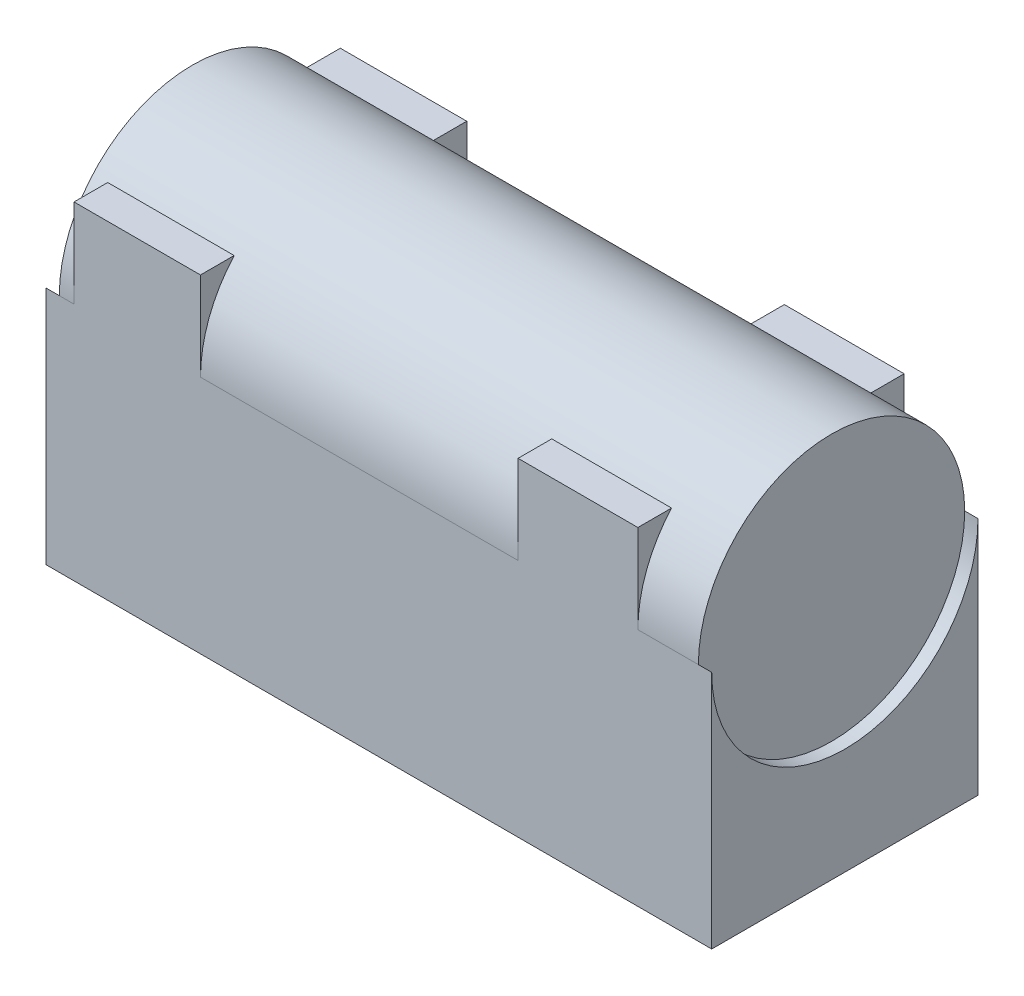
ISO-10303-21;
HEADER;
FILE_DESCRIPTION(('STEP AP214'),'2;1');
FILE_NAME('part.step','',(''),(''),'','','');
FILE_SCHEMA(('AUTOMOTIVE_DESIGN { 1 0 10303 214 1 1 1 1 }'));
ENDSEC;
DATA;
#1=APPLICATION_CONTEXT('core data for automotive mechanical design processes');
#2=APPLICATION_PROTOCOL_DEFINITION('international standard','automotive_design',2000,#1);
#3=PRODUCT_CONTEXT('',#1,'mechanical');
#4=PRODUCT('Part','Part','',(#3));
#5=PRODUCT_RELATED_PRODUCT_CATEGORY('part','',(#4));
#6=PRODUCT_DEFINITION_FORMATION('','',#4);
#7=PRODUCT_DEFINITION_CONTEXT('part definition',#1,'design');
#8=PRODUCT_DEFINITION('design','',#6,#7);
#9=PRODUCT_DEFINITION_SHAPE('','',#8);
#10=(LENGTH_UNIT() NAMED_UNIT(*) SI_UNIT(.MILLI.,.METRE.));
#11=(NAMED_UNIT(*) PLANE_ANGLE_UNIT() SI_UNIT($,.RADIAN.));
#12=(NAMED_UNIT(*) SI_UNIT($,.STERADIAN.) SOLID_ANGLE_UNIT());
#13=UNCERTAINTY_MEASURE_WITH_UNIT(LENGTH_MEASURE(1.E-05),#10,'distance_accuracy_value','');
#14=(GEOMETRIC_REPRESENTATION_CONTEXT(3) GLOBAL_UNCERTAINTY_ASSIGNED_CONTEXT((#13)) GLOBAL_UNIT_ASSIGNED_CONTEXT((#10,
#11,#12)) REPRESENTATION_CONTEXT('',''));
#15=CARTESIAN_POINT('',(0.,0.,0.));
#16=DIRECTION('',(0.,0.,1.));
#17=DIRECTION('',(1.,0.,0.));
#18=AXIS2_PLACEMENT_3D('',#15,#16,#17);
#19=CARTESIAN_POINT('',(12.5,9.,0.));
#20=DIRECTION('',(-1.,0.,0.));
#21=DIRECTION('',(0.,0.,1.));
#22=AXIS2_PLACEMENT_3D('',#19,#20,#21);
#23=CYLINDRICAL_SURFACE('',#22,5.);
#24=DIRECTION('',(-1.,0.,0.));
#25=VECTOR('',#24,1.);
#26=CARTESIAN_POINT('',(12.5,9.,5.));
#27=LINE('',#26,#25);
#28=CARTESIAN_POINT('',(-12.,9.,5.));
#29=VERTEX_POINT('',#28);
#30=CARTESIAN_POINT('',(-12.5,9.,5.));
#31=VERTEX_POINT('',#30);
#32=EDGE_CURVE('E252',#29,#31,#27,.T.);
#33=ORIENTED_EDGE('',*,*,#32,.F.);
#34=CARTESIAN_POINT('',(-12.,9.,0.));
#35=DIRECTION('',(1.,0.,0.));
#36=DIRECTION('',(0.,0.,-1.));
#37=AXIS2_PLACEMENT_3D('',#34,#35,#36);
#38=CIRCLE('',#37,5.);
#39=CARTESIAN_POINT('',(-12.,9.,-5.));
#40=VERTEX_POINT('',#39);
#41=EDGE_CURVE('E207',#29,#40,#38,.T.);
#42=ORIENTED_EDGE('',*,*,#41,.T.);
#43=DIRECTION('',(-1.,0.,0.));
#44=VECTOR('',#43,1.);
#45=CARTESIAN_POINT('',(12.5,9.,-5.));
#46=LINE('',#45,#44);
#47=CARTESIAN_POINT('',(-12.5,9.,-5.));
#48=VERTEX_POINT('',#47);
#49=EDGE_CURVE('E256',#40,#48,#46,.T.);
#50=ORIENTED_EDGE('',*,*,#49,.T.);
#51=CARTESIAN_POINT('',(-12.5,9.,0.));
#52=DIRECTION('',(1.,0.,0.));
#53=DIRECTION('',(0.,0.,-1.));
#54=AXIS2_PLACEMENT_3D('',#51,#52,#53);
#55=CIRCLE('',#54,5.);
#56=EDGE_CURVE('E240',#31,#48,#55,.T.);
#57=ORIENTED_EDGE('',*,*,#56,.F.);
#58=EDGE_LOOP('',(#33,#42,#50,#57));
#59=FACE_BOUND('',#58,.T.);
#60=ADVANCED_FACE('F33',(#59),#23,.F.);
#61=CARTESIAN_POINT('',(12.5,3.,-5.));
#62=DIRECTION('',(0.,0.,1.));
#63=DIRECTION('',(0.,-1.,0.));
#64=AXIS2_PLACEMENT_3D('',#61,#62,#63);
#65=PLANE('',#64);
#66=DIRECTION('',(0.,1.,0.));
#67=VECTOR('',#66,1.);
#68=CARTESIAN_POINT('',(9.72697882381368,12.3237847243729,-5.));
#69=LINE('',#68,#67);
#70=CARTESIAN_POINT('',(9.72697882381368,9.,-5.));
#71=VERTEX_POINT('',#70);
#72=CARTESIAN_POINT('',(9.72697882381368,12.3237847243729,-5.));
#73=VERTEX_POINT('',#72);
#74=EDGE_CURVE('E58',#71,#73,#69,.T.);
#75=ORIENTED_EDGE('',*,*,#74,.F.);
#76=DIRECTION('',(-1.,0.,0.));
#77=VECTOR('',#76,1.);
#78=CARTESIAN_POINT('',(12.,9.,-5.));
#79=LINE('',#78,#77);
#80=CARTESIAN_POINT('',(12.,9.,-5.));
#81=VERTEX_POINT('',#80);
#82=EDGE_CURVE('E215',#71,#81,#79,.F.);
#83=ORIENTED_EDGE('',*,*,#82,.T.);
#84=CARTESIAN_POINT('',(12.5,9.,-5.));
#85=VERTEX_POINT('',#84);
#86=EDGE_CURVE('E259',#85,#81,#46,.T.);
#87=ORIENTED_EDGE('',*,*,#86,.F.);
#88=DIRECTION('',(0.,1.,0.));
#89=VECTOR('',#88,1.);
#90=CARTESIAN_POINT('',(12.5,0.,-5.));
#91=LINE('',#90,#89);
#92=CARTESIAN_POINT('',(12.5,0.,-5.));
#93=VERTEX_POINT('',#92);
#94=EDGE_CURVE('E225',#93,#85,#91,.T.);
#95=ORIENTED_EDGE('',*,*,#94,.F.);
#96=DIRECTION('',(-1.,0.,0.));
#97=VECTOR('',#96,1.);
#98=CARTESIAN_POINT('',(12.5,0.,-5.));
#99=LINE('',#98,#97);
#100=CARTESIAN_POINT('',(-12.5,0.,-5.));
#101=VERTEX_POINT('',#100);
#102=EDGE_CURVE('E237',#93,#101,#99,.T.);
#103=ORIENTED_EDGE('',*,*,#102,.T.);
#104=DIRECTION('',(0.,1.,0.));
#105=VECTOR('',#104,1.);
#106=CARTESIAN_POINT('',(-12.5,3.,-5.));
#107=LINE('',#106,#105);
#108=EDGE_CURVE('E223',#101,#48,#107,.T.);
#109=ORIENTED_EDGE('',*,*,#108,.T.);
#110=ORIENTED_EDGE('',*,*,#49,.F.);
#111=CARTESIAN_POINT('',(-11.4471496698201,9.,-5.));
#112=VERTEX_POINT('',#111);
#113=EDGE_CURVE('E220',#40,#112,#79,.F.);
#114=ORIENTED_EDGE('',*,*,#113,.T.);
#115=DIRECTION('',(0.,-1.,0.));
#116=VECTOR('',#115,1.);
#117=CARTESIAN_POINT('',(-11.4471496698201,5.6762152756271,-5.));
#118=LINE('',#117,#116);
#119=CARTESIAN_POINT('',(-11.4471496698201,12.3237847243729,-5.));
#120=VERTEX_POINT('',#119);
#121=EDGE_CURVE('E195',#120,#112,#118,.T.);
#122=ORIENTED_EDGE('',*,*,#121,.F.);
#123=DIRECTION('',(-1.,0.,0.));
#124=VECTOR('',#123,1.);
#125=CARTESIAN_POINT('',(-11.4471496698201,12.3237847243729,-5.));
#126=LINE('',#125,#124);
#127=CARTESIAN_POINT('',(-6.69919840795785,12.3237847243729,-5.));
#128=VERTEX_POINT('',#127);
#129=EDGE_CURVE('E191',#128,#120,#126,.T.);
#130=ORIENTED_EDGE('',*,*,#129,.F.);
#131=DIRECTION('',(0.,1.,0.));
#132=VECTOR('',#131,1.);
#133=CARTESIAN_POINT('',(-6.69919840795785,5.6762152756271,-5.));
#134=LINE('',#133,#132);
#135=CARTESIAN_POINT('',(-6.69919840795785,9.,-5.));
#136=VERTEX_POINT('',#135);
#137=EDGE_CURVE('E189',#136,#128,#134,.T.);
#138=ORIENTED_EDGE('',*,*,#137,.F.);
#139=CARTESIAN_POINT('',(5.22784904646301,9.,-5.));
#140=VERTEX_POINT('',#139);
#141=EDGE_CURVE('E224',#136,#140,#79,.F.);
#142=ORIENTED_EDGE('',*,*,#141,.T.);
#143=DIRECTION('',(0.,-1.,0.));
#144=VECTOR('',#143,1.);
#145=CARTESIAN_POINT('',(5.22784904646301,12.3237847243729,-5.));
#146=LINE('',#145,#144);
#147=CARTESIAN_POINT('',(5.22784904646301,12.3237847243729,-5.));
#148=VERTEX_POINT('',#147);
#149=EDGE_CURVE('E176',#148,#140,#146,.T.);
#150=ORIENTED_EDGE('',*,*,#149,.F.);
#151=DIRECTION('',(-1.,0.,0.));
#152=VECTOR('',#151,1.);
#153=CARTESIAN_POINT('',(5.22784904646301,12.3237847243729,-5.));
#154=LINE('',#153,#152);
#155=EDGE_CURVE('E164',#73,#148,#154,.T.);
#156=ORIENTED_EDGE('',*,*,#155,.F.);
#157=EDGE_LOOP('',(#75,#83,#87,#95,#103,#109,#110,#114,#122,#130,#138,#142,#150,#156));
#158=FACE_BOUND('',#157,.T.);
#159=ADVANCED_FACE('F35',(#158),#65,.F.);
#160=CARTESIAN_POINT('',(12.,9.,0.));
#161=DIRECTION('',(1.,0.,0.));
#162=DIRECTION('',(0.,0.,-1.));
#163=AXIS2_PLACEMENT_3D('',#160,#161,#162);
#164=CIRCLE('',#163,5.);
#165=CARTESIAN_POINT('',(12.,9.,5.));
#166=VERTEX_POINT('',#165);
#167=EDGE_CURVE('E216',#166,#81,#164,.T.);
#168=ORIENTED_EDGE('',*,*,#167,.F.);
#169=CARTESIAN_POINT('',(12.5,9.,5.));
#170=VERTEX_POINT('',#169);
#171=EDGE_CURVE('E253',#170,#166,#27,.T.);
#172=ORIENTED_EDGE('',*,*,#171,.F.);
#173=CARTESIAN_POINT('',(12.5,9.,0.));
#174=DIRECTION('',(1.,0.,0.));
#175=DIRECTION('',(0.,0.,-1.));
#176=AXIS2_PLACEMENT_3D('',#173,#174,#175);
#177=CIRCLE('',#176,5.);
#178=EDGE_CURVE('E227',#170,#85,#177,.T.);
#179=ORIENTED_EDGE('',*,*,#178,.T.);
#180=ORIENTED_EDGE('',*,*,#86,.T.);
#181=EDGE_LOOP('',(#168,#172,#179,#180));
#182=FACE_BOUND('',#181,.T.);
#183=ADVANCED_FACE('F299',(#182),#23,.F.);
#184=CARTESIAN_POINT('',(12.5,0.,5.));
#185=DIRECTION('',(0.,0.,1.));
#186=DIRECTION('',(1.,0.,0.));
#187=AXIS2_PLACEMENT_3D('',#184,#185,#186);
#188=PLANE('',#187);
#189=CARTESIAN_POINT('',(9.72697882381368,9.,5.));
#190=VERTEX_POINT('',#189);
#191=EDGE_CURVE('E257',#166,#190,#27,.T.);
#192=ORIENTED_EDGE('',*,*,#191,.T.);
#193=DIRECTION('',(0.,1.,0.));
#194=VECTOR('',#193,1.);
#195=CARTESIAN_POINT('',(9.72697882381368,12.3237847243729,5.));
#196=LINE('',#195,#194);
#197=CARTESIAN_POINT('',(9.72697882381368,12.3237847243729,5.));
#198=VERTEX_POINT('',#197);
#199=EDGE_CURVE('E180',#190,#198,#196,.T.);
#200=ORIENTED_EDGE('',*,*,#199,.T.);
#201=DIRECTION('',(-1.,0.,0.));
#202=VECTOR('',#201,1.);
#203=CARTESIAN_POINT('',(5.22784904646301,12.3237847243729,5.));
#204=LINE('',#203,#202);
#205=CARTESIAN_POINT('',(5.22784904646301,12.3237847243729,5.));
#206=VERTEX_POINT('',#205);
#207=EDGE_CURVE('E183',#198,#206,#204,.T.);
#208=ORIENTED_EDGE('',*,*,#207,.T.);
#209=DIRECTION('',(0.,-1.,0.));
#210=VECTOR('',#209,1.);
#211=CARTESIAN_POINT('',(5.22784904646301,12.3237847243729,5.));
#212=LINE('',#211,#210);
#213=CARTESIAN_POINT('',(5.22784904646301,9.,5.));
#214=VERTEX_POINT('',#213);
#215=EDGE_CURVE('E50',#206,#214,#212,.T.);
#216=ORIENTED_EDGE('',*,*,#215,.T.);
#217=CARTESIAN_POINT('',(-6.69919840795785,9.,5.));
#218=VERTEX_POINT('',#217);
#219=EDGE_CURVE('E258',#214,#218,#27,.T.);
#220=ORIENTED_EDGE('',*,*,#219,.T.);
#221=DIRECTION('',(0.,1.,0.));
#222=VECTOR('',#221,1.);
#223=CARTESIAN_POINT('',(-6.69919840795785,5.6762152756271,5.));
#224=LINE('',#223,#222);
#225=CARTESIAN_POINT('',(-6.69919840795785,12.3237847243729,5.));
#226=VERTEX_POINT('',#225);
#227=EDGE_CURVE('E187',#218,#226,#224,.T.);
#228=ORIENTED_EDGE('',*,*,#227,.T.);
#229=DIRECTION('',(-1.,0.,0.));
#230=VECTOR('',#229,1.);
#231=CARTESIAN_POINT('',(-11.4471496698201,12.3237847243729,5.));
#232=LINE('',#231,#230);
#233=CARTESIAN_POINT('',(-11.4471496698201,12.3237847243729,5.));
#234=VERTEX_POINT('',#233);
#235=EDGE_CURVE('E200',#226,#234,#232,.T.);
#236=ORIENTED_EDGE('',*,*,#235,.T.);
#237=DIRECTION('',(0.,-1.,0.));
#238=VECTOR('',#237,1.);
#239=CARTESIAN_POINT('',(-11.4471496698201,5.6762152756271,5.));
#240=LINE('',#239,#238);
#241=CARTESIAN_POINT('',(-11.4471496698201,9.,5.));
#242=VERTEX_POINT('',#241);
#243=EDGE_CURVE('E192',#234,#242,#240,.T.);
#244=ORIENTED_EDGE('',*,*,#243,.T.);
#245=EDGE_CURVE('E322',#242,#29,#27,.T.);
#246=ORIENTED_EDGE('',*,*,#245,.T.);
#247=ORIENTED_EDGE('',*,*,#32,.T.);
#248=DIRECTION('',(0.,1.,0.));
#249=VECTOR('',#248,1.);
#250=CARTESIAN_POINT('',(-12.5,0.,5.));
#251=LINE('',#250,#249);
#252=CARTESIAN_POINT('',(-12.5,0.,5.));
#253=VERTEX_POINT('',#252);
#254=EDGE_CURVE('E243',#253,#31,#251,.T.);
#255=ORIENTED_EDGE('',*,*,#254,.F.);
#256=DIRECTION('',(-1.,0.,0.));
#257=VECTOR('',#256,1.);
#258=CARTESIAN_POINT('',(12.5,0.,5.));
#259=LINE('',#258,#257);
#260=CARTESIAN_POINT('',(12.5,0.,5.));
#261=VERTEX_POINT('',#260);
#262=EDGE_CURVE('E250',#261,#253,#259,.T.);
#263=ORIENTED_EDGE('',*,*,#262,.F.);
#264=DIRECTION('',(0.,1.,0.));
#265=VECTOR('',#264,1.);
#266=CARTESIAN_POINT('',(12.5,3.,5.));
#267=LINE('',#266,#265);
#268=EDGE_CURVE('E231',#261,#170,#267,.T.);
#269=ORIENTED_EDGE('',*,*,#268,.T.);
#270=ORIENTED_EDGE('',*,*,#171,.T.);
#271=EDGE_LOOP('',(#192,#200,#208,#216,#220,#228,#236,#244,#246,#247,#255,#263,#269,#270));
#272=FACE_BOUND('',#271,.T.);
#273=ADVANCED_FACE('F305',(#272),#188,.T.);
#274=CARTESIAN_POINT('',(12.5,0.,-5.));
#275=DIRECTION('',(0.,-1.,0.));
#276=DIRECTION('',(0.,0.,-1.));
#277=AXIS2_PLACEMENT_3D('',#274,#275,#276);
#278=PLANE('',#277);
#279=DIRECTION('',(0.,0.,1.));
#280=VECTOR('',#279,1.);
#281=CARTESIAN_POINT('',(-12.5,0.,-5.));
#282=LINE('',#281,#280);
#283=EDGE_CURVE('E228',#101,#253,#282,.T.);
#284=ORIENTED_EDGE('',*,*,#283,.F.);
#285=ORIENTED_EDGE('',*,*,#102,.F.);
#286=DIRECTION('',(0.,0.,1.));
#287=VECTOR('',#286,1.);
#288=CARTESIAN_POINT('',(12.5,0.,-5.));
#289=LINE('',#288,#287);
#290=EDGE_CURVE('E234',#93,#261,#289,.T.);
#291=ORIENTED_EDGE('',*,*,#290,.T.);
#292=ORIENTED_EDGE('',*,*,#262,.T.);
#293=EDGE_LOOP('',(#284,#285,#291,#292));
#294=FACE_BOUND('',#293,.T.);
#295=ADVANCED_FACE('F309',(#294),#278,.T.);
#296=CARTESIAN_POINT('',(12.5,9.,0.));
#297=DIRECTION('',(1.,0.,0.));
#298=DIRECTION('',(0.,0.,-1.));
#299=AXIS2_PLACEMENT_3D('',#296,#297,#298);
#300=PLANE('',#299);
#301=ORIENTED_EDGE('',*,*,#94,.T.);
#302=ORIENTED_EDGE('',*,*,#178,.F.);
#303=ORIENTED_EDGE('',*,*,#268,.F.);
#304=ORIENTED_EDGE('',*,*,#290,.F.);
#305=EDGE_LOOP('',(#301,#302,#303,#304));
#306=FACE_BOUND('',#305,.T.);
#307=ADVANCED_FACE('F302',(#306),#300,.T.);
#308=CARTESIAN_POINT('',(-12.5,9.,0.));
#309=DIRECTION('',(1.,0.,0.));
#310=DIRECTION('',(0.,0.,-1.));
#311=AXIS2_PLACEMENT_3D('',#308,#309,#310);
#312=PLANE('',#311);
#313=ORIENTED_EDGE('',*,*,#108,.F.);
#314=ORIENTED_EDGE('',*,*,#283,.T.);
#315=ORIENTED_EDGE('',*,*,#254,.T.);
#316=ORIENTED_EDGE('',*,*,#56,.T.);
#317=EDGE_LOOP('',(#313,#314,#315,#316));
#318=FACE_BOUND('',#317,.T.);
#319=ADVANCED_FACE('F313',(#318),#312,.F.);
#320=CARTESIAN_POINT('',(12.,9.,0.));
#321=DIRECTION('',(-1.,0.,0.));
#322=DIRECTION('',(0.,0.,1.));
#323=AXIS2_PLACEMENT_3D('',#320,#321,#322);
#324=CYLINDRICAL_SURFACE('',#323,5.);
#325=ORIENTED_EDGE('',*,*,#82,.F.);
#326=CARTESIAN_POINT('',(9.72697882381368,9.,0.));
#327=DIRECTION('',(1.,0.,0.));
#328=DIRECTION('',(0.,0.,-1.));
#329=AXIS2_PLACEMENT_3D('',#326,#327,#328);
#330=CIRCLE('',#329,5.);
#331=CARTESIAN_POINT('',(9.72697882381368,12.3237847243729,-3.73529852970621));
#332=VERTEX_POINT('',#331);
#333=EDGE_CURVE('E11',#71,#332,#330,.T.);
#334=ORIENTED_EDGE('',*,*,#333,.T.);
#335=DIRECTION('',(-1.,0.,0.));
#336=VECTOR('',#335,1.);
#337=CARTESIAN_POINT('',(12.,12.3237847243729,-3.73529852970621));
#338=LINE('',#337,#336);
#339=CARTESIAN_POINT('',(5.22784904646301,12.3237847243729,-3.73529852970621));
#340=VERTEX_POINT('',#339);
#341=EDGE_CURVE('E37',#332,#340,#338,.T.);
#342=ORIENTED_EDGE('',*,*,#341,.T.);
#343=CARTESIAN_POINT('',(5.22784904646301,9.,0.));
#344=DIRECTION('',(-1.,0.,0.));
#345=DIRECTION('',(0.,0.,1.));
#346=AXIS2_PLACEMENT_3D('',#343,#344,#345);
#347=CIRCLE('',#346,5.);
#348=EDGE_CURVE('E42',#340,#140,#347,.T.);
#349=ORIENTED_EDGE('',*,*,#348,.T.);
#350=ORIENTED_EDGE('',*,*,#141,.F.);
#351=CARTESIAN_POINT('',(-6.69919840795785,9.,0.));
#352=DIRECTION('',(1.,0.,0.));
#353=DIRECTION('',(0.,0.,-1.));
#354=AXIS2_PLACEMENT_3D('',#351,#352,#353);
#355=CIRCLE('',#354,5.);
#356=CARTESIAN_POINT('',(-6.69919840795785,12.3237847243729,-3.73529852970621));
#357=VERTEX_POINT('',#356);
#358=EDGE_CURVE('E273',#136,#357,#355,.T.);
#359=ORIENTED_EDGE('',*,*,#358,.T.);
#360=DIRECTION('',(-1.,0.,0.));
#361=VECTOR('',#360,1.);
#362=CARTESIAN_POINT('',(12.,12.3237847243729,-3.73529852970621));
#363=LINE('',#362,#361);
#364=CARTESIAN_POINT('',(-11.4471496698201,12.3237847243729,-3.73529852970621));
#365=VERTEX_POINT('',#364);
#366=EDGE_CURVE('E272',#357,#365,#363,.T.);
#367=ORIENTED_EDGE('',*,*,#366,.T.);
#368=CARTESIAN_POINT('',(-11.4471496698201,9.,0.));
#369=DIRECTION('',(-1.,0.,0.));
#370=DIRECTION('',(0.,0.,1.));
#371=AXIS2_PLACEMENT_3D('',#368,#369,#370);
#372=CIRCLE('',#371,5.);
#373=EDGE_CURVE('E269',#365,#112,#372,.T.);
#374=ORIENTED_EDGE('',*,*,#373,.T.);
#375=ORIENTED_EDGE('',*,*,#113,.F.);
#376=EDGE_CURVE('E217',#40,#29,#38,.T.);
#377=ORIENTED_EDGE('',*,*,#376,.T.);
#378=ORIENTED_EDGE('',*,*,#245,.F.);
#379=CARTESIAN_POINT('',(-11.4471496698201,12.3237847243729,3.73529852970621));
#380=VERTEX_POINT('',#379);
#381=EDGE_CURVE('E265',#242,#380,#372,.T.);
#382=ORIENTED_EDGE('',*,*,#381,.T.);
#383=DIRECTION('',(-1.,0.,0.));
#384=VECTOR('',#383,1.);
#385=CARTESIAN_POINT('',(12.,12.3237847243729,3.73529852970621));
#386=LINE('',#385,#384);
#387=CARTESIAN_POINT('',(-6.69919840795785,12.3237847243729,3.73529852970621));
#388=VERTEX_POINT('',#387);
#389=EDGE_CURVE('E262',#380,#388,#386,.F.);
#390=ORIENTED_EDGE('',*,*,#389,.T.);
#391=EDGE_CURVE('E268',#388,#218,#355,.T.);
#392=ORIENTED_EDGE('',*,*,#391,.T.);
#393=ORIENTED_EDGE('',*,*,#219,.F.);
#394=CARTESIAN_POINT('',(5.22784904646301,12.3237847243729,3.73529852970621));
#395=VERTEX_POINT('',#394);
#396=EDGE_CURVE('E279',#214,#395,#347,.T.);
#397=ORIENTED_EDGE('',*,*,#396,.T.);
#398=DIRECTION('',(-1.,0.,0.));
#399=VECTOR('',#398,1.);
#400=CARTESIAN_POINT('',(12.,12.3237847243729,3.73529852970621));
#401=LINE('',#400,#399);
#402=CARTESIAN_POINT('',(9.72697882381368,12.3237847243729,3.73529852970621));
#403=VERTEX_POINT('',#402);
#404=EDGE_CURVE('E276',#395,#403,#401,.F.);
#405=ORIENTED_EDGE('',*,*,#404,.T.);
#406=EDGE_CURVE('E43',#403,#190,#330,.T.);
#407=ORIENTED_EDGE('',*,*,#406,.T.);
#408=ORIENTED_EDGE('',*,*,#191,.F.);
#409=EDGE_CURVE('E212',#81,#166,#164,.T.);
#410=ORIENTED_EDGE('',*,*,#409,.F.);
#411=EDGE_LOOP('',(#325,#334,#342,#349,#350,#359,#367,#374,#375,#377,#378,#382,#390,#392,#393,
#397,#405,#407,#408,#410));
#412=FACE_BOUND('',#411,.T.);
#413=ADVANCED_FACE('F286',(#412),#324,.T.);
#414=CARTESIAN_POINT('',(12.,0.,0.));
#415=DIRECTION('',(1.,0.,0.));
#416=DIRECTION('',(0.,0.,-1.));
#417=AXIS2_PLACEMENT_3D('',#414,#415,#416);
#418=PLANE('',#417);
#419=ORIENTED_EDGE('',*,*,#409,.T.);
#420=ORIENTED_EDGE('',*,*,#167,.T.);
#421=EDGE_LOOP('',(#419,#420));
#422=FACE_BOUND('',#421,.T.);
#423=ADVANCED_FACE('F297',(#422),#418,.T.);
#424=CARTESIAN_POINT('',(-12.,0.,0.));
#425=DIRECTION('',(1.,0.,0.));
#426=DIRECTION('',(0.,0.,-1.));
#427=AXIS2_PLACEMENT_3D('',#424,#425,#426);
#428=PLANE('',#427);
#429=ORIENTED_EDGE('',*,*,#376,.F.);
#430=ORIENTED_EDGE('',*,*,#41,.F.);
#431=EDGE_LOOP('',(#429,#430));
#432=FACE_BOUND('',#431,.T.);
#433=ADVANCED_FACE('F320',(#432),#428,.F.);
#434=CARTESIAN_POINT('',(-11.4471496698201,12.3237847243729,-5.));
#435=DIRECTION('',(0.,1.,0.));
#436=DIRECTION('',(0.,0.,1.));
#437=AXIS2_PLACEMENT_3D('',#434,#435,#436);
#438=PLANE('',#437);
#439=ORIENTED_EDGE('',*,*,#389,.F.);
#440=DIRECTION('',(0.,0.,1.));
#441=VECTOR('',#440,1.);
#442=CARTESIAN_POINT('',(-11.4471496698201,12.3237847243729,-5.));
#443=LINE('',#442,#441);
#444=EDGE_CURVE('E208',#380,#234,#443,.T.);
#445=ORIENTED_EDGE('',*,*,#444,.T.);
#446=ORIENTED_EDGE('',*,*,#235,.F.);
#447=DIRECTION('',(0.,0.,1.));
#448=VECTOR('',#447,1.);
#449=CARTESIAN_POINT('',(-6.69919840795785,12.3237847243729,-5.));
#450=LINE('',#449,#448);
#451=EDGE_CURVE('E197',#388,#226,#450,.T.);
#452=ORIENTED_EDGE('',*,*,#451,.F.);
#453=EDGE_LOOP('',(#439,#445,#446,#452));
#454=FACE_BOUND('',#453,.T.);
#455=ADVANCED_FACE('F340',(#454),#438,.T.);
#456=CARTESIAN_POINT('',(-11.4471496698201,5.6762152756271,-5.));
#457=DIRECTION('',(-1.,0.,0.));
#458=DIRECTION('',(0.,0.,1.));
#459=AXIS2_PLACEMENT_3D('',#456,#457,#458);
#460=PLANE('',#459);
#461=ORIENTED_EDGE('',*,*,#381,.F.);
#462=ORIENTED_EDGE('',*,*,#243,.F.);
#463=ORIENTED_EDGE('',*,*,#444,.F.);
#464=EDGE_LOOP('',(#461,#462,#463));
#465=FACE_BOUND('',#464,.T.);
#466=ADVANCED_FACE('F341',(#465),#460,.T.);
#467=CARTESIAN_POINT('',(-6.69919840795785,5.6762152756271,-5.));
#468=DIRECTION('',(1.,0.,0.));
#469=DIRECTION('',(0.,0.,-1.));
#470=AXIS2_PLACEMENT_3D('',#467,#468,#469);
#471=PLANE('',#470);
#472=ORIENTED_EDGE('',*,*,#391,.F.);
#473=ORIENTED_EDGE('',*,*,#451,.T.);
#474=ORIENTED_EDGE('',*,*,#227,.F.);
#475=EDGE_LOOP('',(#472,#473,#474));
#476=FACE_BOUND('',#475,.T.);
#477=ADVANCED_FACE('F332',(#476),#471,.T.);
#478=ORIENTED_EDGE('',*,*,#358,.F.);
#479=ORIENTED_EDGE('',*,*,#137,.T.);
#480=EDGE_CURVE('E209',#128,#357,#450,.T.);
#481=ORIENTED_EDGE('',*,*,#480,.T.);
#482=EDGE_LOOP('',(#478,#479,#481));
#483=FACE_BOUND('',#482,.T.);
#484=ADVANCED_FACE('F330',(#483),#471,.T.);
#485=ORIENTED_EDGE('',*,*,#366,.F.);
#486=ORIENTED_EDGE('',*,*,#480,.F.);
#487=ORIENTED_EDGE('',*,*,#129,.T.);
#488=EDGE_CURVE('E204',#120,#365,#443,.T.);
#489=ORIENTED_EDGE('',*,*,#488,.T.);
#490=EDGE_LOOP('',(#485,#486,#487,#489));
#491=FACE_BOUND('',#490,.T.);
#492=ADVANCED_FACE('F328',(#491),#438,.T.);
#493=ORIENTED_EDGE('',*,*,#373,.F.);
#494=ORIENTED_EDGE('',*,*,#488,.F.);
#495=ORIENTED_EDGE('',*,*,#121,.T.);
#496=EDGE_LOOP('',(#493,#494,#495));
#497=FACE_BOUND('',#496,.T.);
#498=ADVANCED_FACE('F338',(#497),#460,.T.);
#499=CARTESIAN_POINT('',(5.22784904646301,12.3237847243729,-5.));
#500=DIRECTION('',(0.,1.,0.));
#501=DIRECTION('',(0.,0.,1.));
#502=AXIS2_PLACEMENT_3D('',#499,#500,#501);
#503=PLANE('',#502);
#504=ORIENTED_EDGE('',*,*,#404,.F.);
#505=DIRECTION('',(0.,0.,1.));
#506=VECTOR('',#505,1.);
#507=CARTESIAN_POINT('',(5.22784904646301,12.3237847243729,-5.));
#508=LINE('',#507,#506);
#509=EDGE_CURVE('E171',#395,#206,#508,.T.);
#510=ORIENTED_EDGE('',*,*,#509,.T.);
#511=ORIENTED_EDGE('',*,*,#207,.F.);
#512=DIRECTION('',(0.,0.,1.));
#513=VECTOR('',#512,1.);
#514=CARTESIAN_POINT('',(9.72697882381368,12.3237847243729,-5.));
#515=LINE('',#514,#513);
#516=EDGE_CURVE('E172',#403,#198,#515,.T.);
#517=ORIENTED_EDGE('',*,*,#516,.F.);
#518=EDGE_LOOP('',(#504,#510,#511,#517));
#519=FACE_BOUND('',#518,.T.);
#520=ADVANCED_FACE('F411',(#519),#503,.T.);
#521=CARTESIAN_POINT('',(5.22784904646301,12.3237847243729,-5.));
#522=DIRECTION('',(-1.,0.,0.));
#523=DIRECTION('',(0.,0.,1.));
#524=AXIS2_PLACEMENT_3D('',#521,#522,#523);
#525=PLANE('',#524);
#526=ORIENTED_EDGE('',*,*,#396,.F.);
#527=ORIENTED_EDGE('',*,*,#215,.F.);
#528=ORIENTED_EDGE('',*,*,#509,.F.);
#529=EDGE_LOOP('',(#526,#527,#528));
#530=FACE_BOUND('',#529,.T.);
#531=ADVANCED_FACE('F419',(#530),#525,.T.);
#532=CARTESIAN_POINT('',(9.72697882381368,12.3237847243729,-5.));
#533=DIRECTION('',(1.,0.,0.));
#534=DIRECTION('',(0.,0.,-1.));
#535=AXIS2_PLACEMENT_3D('',#532,#533,#534);
#536=PLANE('',#535);
#537=ORIENTED_EDGE('',*,*,#406,.F.);
#538=ORIENTED_EDGE('',*,*,#516,.T.);
#539=ORIENTED_EDGE('',*,*,#199,.F.);
#540=EDGE_LOOP('',(#537,#538,#539));
#541=FACE_BOUND('',#540,.T.);
#542=ADVANCED_FACE('F429',(#541),#536,.T.);
#543=ORIENTED_EDGE('',*,*,#333,.F.);
#544=ORIENTED_EDGE('',*,*,#74,.T.);
#545=EDGE_CURVE('E162',#73,#332,#515,.T.);
#546=ORIENTED_EDGE('',*,*,#545,.T.);
#547=EDGE_LOOP('',(#543,#544,#546));
#548=FACE_BOUND('',#547,.T.);
#549=ADVANCED_FACE('F161',(#548),#536,.T.);
#550=ORIENTED_EDGE('',*,*,#341,.F.);
#551=ORIENTED_EDGE('',*,*,#545,.F.);
#552=ORIENTED_EDGE('',*,*,#155,.T.);
#553=EDGE_CURVE('E186',#148,#340,#508,.T.);
#554=ORIENTED_EDGE('',*,*,#553,.T.);
#555=EDGE_LOOP('',(#550,#551,#552,#554));
#556=FACE_BOUND('',#555,.T.);
#557=ADVANCED_FACE('F168',(#556),#503,.T.);
#558=ORIENTED_EDGE('',*,*,#348,.F.);
#559=ORIENTED_EDGE('',*,*,#553,.F.);
#560=ORIENTED_EDGE('',*,*,#149,.T.);
#561=EDGE_LOOP('',(#558,#559,#560));
#562=FACE_BOUND('',#561,.T.);
#563=ADVANCED_FACE('F432',(#562),#525,.T.);
#564=CLOSED_SHELL('',(#60,#159,#183,#273,#295,#307,#319,#413,#423,#433,#455,#466,#477,#484,#492,
#498,#520,#531,#542,#549,#557,#563));
#565=MANIFOLD_SOLID_BREP('B2',#564);
#566=ADVANCED_BREP_SHAPE_REPRESENTATION('',(#18,#565),#14);
#567=SHAPE_DEFINITION_REPRESENTATION(#9,#566);
ENDSEC;
END-ISO-10303-21;
